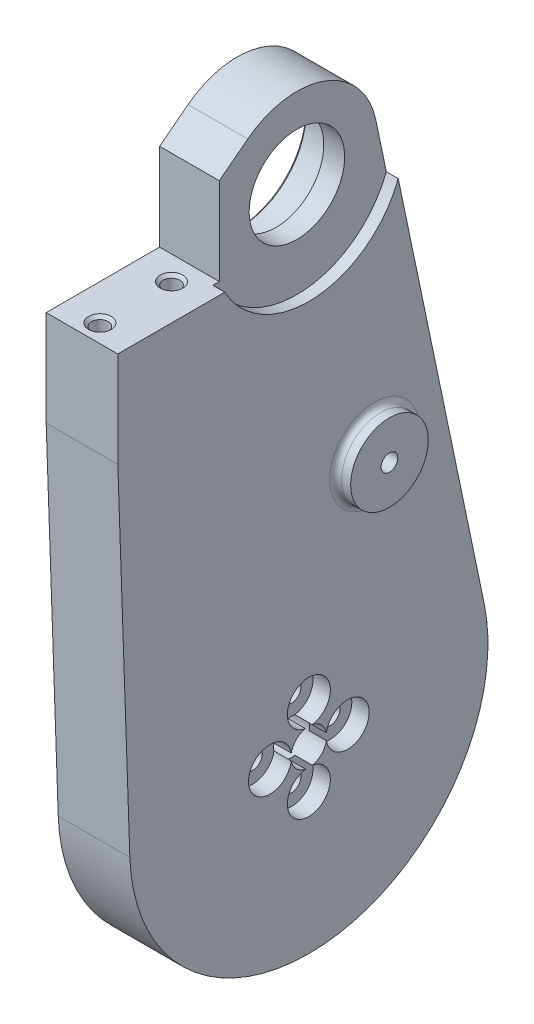
ISO-10303-21;
HEADER;
FILE_DESCRIPTION(('STEP AP214'),'2;1');
FILE_NAME('part.step','',(''),(''),'','','');
FILE_SCHEMA(('AUTOMOTIVE_DESIGN { 1 0 10303 214 1 1 1 1 }'));
ENDSEC;
DATA;
#1=APPLICATION_CONTEXT('core data for automotive mechanical design processes');
#2=APPLICATION_PROTOCOL_DEFINITION('international standard','automotive_design',2000,#1);
#3=PRODUCT_CONTEXT('',#1,'mechanical');
#4=PRODUCT('Part','Part','',(#3));
#5=PRODUCT_RELATED_PRODUCT_CATEGORY('part','',(#4));
#6=PRODUCT_DEFINITION_FORMATION('','',#4);
#7=PRODUCT_DEFINITION_CONTEXT('part definition',#1,'design');
#8=PRODUCT_DEFINITION('design','',#6,#7);
#9=PRODUCT_DEFINITION_SHAPE('','',#8);
#10=(LENGTH_UNIT() NAMED_UNIT(*) SI_UNIT(.MILLI.,.METRE.));
#11=(NAMED_UNIT(*) PLANE_ANGLE_UNIT() SI_UNIT($,.RADIAN.));
#12=(NAMED_UNIT(*) SI_UNIT($,.STERADIAN.) SOLID_ANGLE_UNIT());
#13=UNCERTAINTY_MEASURE_WITH_UNIT(LENGTH_MEASURE(1.E-05),#10,'distance_accuracy_value','');
#14=(GEOMETRIC_REPRESENTATION_CONTEXT(3) GLOBAL_UNCERTAINTY_ASSIGNED_CONTEXT((#13)) GLOBAL_UNIT_ASSIGNED_CONTEXT((#10,
#11,#12)) REPRESENTATION_CONTEXT('',''));
#15=CARTESIAN_POINT('',(0.,0.,0.));
#16=DIRECTION('',(0.,0.,1.));
#17=DIRECTION('',(1.,0.,0.));
#18=AXIS2_PLACEMENT_3D('',#15,#16,#17);
#19=CARTESIAN_POINT('',(57.,73.,32.));
#20=DIRECTION('',(0.,-0.7923556344167,-0.610059463173966));
#21=DIRECTION('',(0.,-0.610059463173966,0.792355634416701));
#22=AXIS2_PLACEMENT_3D('',#19,#20,#21);
#23=PLANE('',#22);
#24=DIRECTION('',(0.,0.610059463173966,-0.792355634416701));
#25=VECTOR('',#24,1.);
#26=CARTESIAN_POINT('',(55.,73.,32.));
#27=LINE('',#26,#25);
#28=CARTESIAN_POINT('',(55.,87.6286961268828,13.));
#29=VERTEX_POINT('',#28);
#30=CARTESIAN_POINT('',(55.,91.2968010646259,8.23580275284801));
#31=VERTEX_POINT('',#30);
#32=EDGE_CURVE('E202',#29,#31,#27,.T.);
#33=ORIENTED_EDGE('',*,*,#32,.T.);
#34=DIRECTION('',(-1.,0.,0.));
#35=VECTOR('',#34,1.);
#36=CARTESIAN_POINT('',(57.,91.2968010646259,8.235802752848));
#37=LINE('',#36,#35);
#38=CARTESIAN_POINT('',(45.,91.2968010646259,8.235802752848));
#39=VERTEX_POINT('',#38);
#40=EDGE_CURVE('E288',#31,#39,#37,.T.);
#41=ORIENTED_EDGE('',*,*,#40,.T.);
#42=DIRECTION('',(0.,0.610059463173966,-0.792355634416701));
#43=VECTOR('',#42,1.);
#44=CARTESIAN_POINT('',(45.,73.,32.));
#45=LINE('',#44,#43);
#46=CARTESIAN_POINT('',(45.,87.6286961268828,13.));
#47=VERTEX_POINT('',#46);
#48=EDGE_CURVE('E185',#47,#39,#45,.T.);
#49=ORIENTED_EDGE('',*,*,#48,.F.);
#50=DIRECTION('',(1.,0.,0.));
#51=VECTOR('',#50,1.);
#52=CARTESIAN_POINT('',(57.,87.6286961268828,13.));
#53=LINE('',#52,#51);
#54=EDGE_CURVE('E277',#47,#29,#53,.T.);
#55=ORIENTED_EDGE('',*,*,#54,.T.);
#56=EDGE_LOOP('',(#33,#41,#49,#55));
#57=FACE_BOUND('',#56,.T.);
#58=ADVANCED_FACE('F41',(#57),#23,.F.);
#59=CARTESIAN_POINT('',(57.,80.6,0.));
#60=DIRECTION('',(-1.,0.,0.));
#61=DIRECTION('',(0.,0.,-1.));
#62=AXIS2_PLACEMENT_3D('',#59,#60,#61);
#63=CYLINDRICAL_SURFACE('',#62,13.5);
#64=CARTESIAN_POINT('',(55.,80.6,0.));
#65=DIRECTION('',(-1.,0.,0.));
#66=DIRECTION('',(0.,0.,1.));
#67=AXIS2_PLACEMENT_3D('',#64,#65,#66);
#68=CIRCLE('',#67,13.5);
#69=CARTESIAN_POINT('',(55.,83.3636476426799,-13.2140929203298));
#70=VERTEX_POINT('',#69);
#71=EDGE_CURVE('E205',#31,#70,#68,.T.);
#72=ORIENTED_EDGE('',*,*,#71,.T.);
#73=DIRECTION('',(-1.,0.,0.));
#74=VECTOR('',#73,1.);
#75=CARTESIAN_POINT('',(57.,83.3636476426799,-13.2140929203298));
#76=LINE('',#75,#74);
#77=CARTESIAN_POINT('',(45.,83.3636476426799,-13.2140929203298));
#78=VERTEX_POINT('',#77);
#79=EDGE_CURVE('E315',#70,#78,#76,.T.);
#80=ORIENTED_EDGE('',*,*,#79,.T.);
#81=CARTESIAN_POINT('',(45.,80.6,0.));
#82=DIRECTION('',(-1.,0.,0.));
#83=DIRECTION('',(0.,0.,1.));
#84=AXIS2_PLACEMENT_3D('',#81,#82,#83);
#85=CIRCLE('',#84,13.5);
#86=EDGE_CURVE('E279',#39,#78,#85,.T.);
#87=ORIENTED_EDGE('',*,*,#86,.F.);
#88=ORIENTED_EDGE('',*,*,#40,.F.);
#89=EDGE_LOOP('',(#72,#80,#87,#88));
#90=FACE_BOUND('',#89,.T.);
#91=ADVANCED_FACE('F407',(#90),#63,.T.);
#92=CARTESIAN_POINT('',(85.,150.,13.));
#93=DIRECTION('',(0.,0.,1.));
#94=DIRECTION('',(-1.,0.,0.));
#95=AXIS2_PLACEMENT_3D('',#92,#93,#94);
#96=PLANE('',#95);
#97=ORIENTED_EDGE('',*,*,#54,.F.);
#98=DIRECTION('',(0.,1.,0.));
#99=VECTOR('',#98,1.);
#100=CARTESIAN_POINT('',(45.,80.6,13.));
#101=LINE('',#100,#99);
#102=CARTESIAN_POINT('',(45.,73.,13.));
#103=VERTEX_POINT('',#102);
#104=EDGE_CURVE('E318',#103,#47,#101,.T.);
#105=ORIENTED_EDGE('',*,*,#104,.F.);
#106=DIRECTION('',(-1.,0.,0.));
#107=VECTOR('',#106,1.);
#108=CARTESIAN_POINT('',(85.,73.,13.));
#109=LINE('',#108,#107);
#110=CARTESIAN_POINT('',(55.,73.,13.));
#111=VERTEX_POINT('',#110);
#112=EDGE_CURVE('E272',#111,#103,#109,.T.);
#113=ORIENTED_EDGE('',*,*,#112,.F.);
#114=DIRECTION('',(0.,-1.,0.));
#115=VECTOR('',#114,1.);
#116=CARTESIAN_POINT('',(55.,150.,13.));
#117=LINE('',#116,#115);
#118=EDGE_CURVE('E193',#29,#111,#117,.T.);
#119=ORIENTED_EDGE('',*,*,#118,.F.);
#120=EDGE_LOOP('',(#97,#105,#113,#119));
#121=FACE_BOUND('',#120,.T.);
#122=ADVANCED_FACE('F415',(#121),#96,.T.);
#123=CARTESIAN_POINT('',(37.,6.5,0.));
#124=DIRECTION('',(1.,0.,0.));
#125=DIRECTION('',(0.,0.,1.));
#126=AXIS2_PLACEMENT_3D('',#123,#124,#125);
#127=CYLINDRICAL_SURFACE('',#126,1.6);
#128=CARTESIAN_POINT('',(37.,6.5,0.));
#129=DIRECTION('',(-1.,0.,0.));
#130=DIRECTION('',(0.,-1.,0.));
#131=AXIS2_PLACEMENT_3D('',#128,#129,#130);
#132=CIRCLE('',#131,1.6);
#133=CARTESIAN_POINT('',(37.,4.9,0.));
#134=VERTEX_POINT('',#133);
#135=EDGE_CURVE('E234',#134,#134,#132,.T.);
#136=ORIENTED_EDGE('',*,*,#135,.T.);
#137=EDGE_LOOP('',(#136));
#138=FACE_BOUND('',#137,.T.);
#139=CARTESIAN_POINT('',(54.1,6.5,0.));
#140=DIRECTION('',(-1.,0.,0.));
#141=DIRECTION('',(0.,0.,1.));
#142=AXIS2_PLACEMENT_3D('',#139,#140,#141);
#143=CIRCLE('',#142,1.6);
#144=CARTESIAN_POINT('',(54.1,6.5,1.59999999999991));
#145=VERTEX_POINT('',#144);
#146=EDGE_CURVE('E230',#145,#145,#143,.F.);
#147=ORIENTED_EDGE('',*,*,#146,.T.);
#148=EDGE_LOOP('',(#147));
#149=FACE_BOUND('',#148,.T.);
#150=ADVANCED_FACE('F535',(#138,#149),#127,.F.);
#151=CARTESIAN_POINT('',(37.,0.,6.5));
#152=DIRECTION('',(1.,0.,0.));
#153=DIRECTION('',(0.,0.,1.));
#154=AXIS2_PLACEMENT_3D('',#151,#152,#153);
#155=CYLINDRICAL_SURFACE('',#154,1.6);
#156=CARTESIAN_POINT('',(37.,0.,6.5));
#157=DIRECTION('',(-1.,0.,0.));
#158=DIRECTION('',(0.,0.,-1.));
#159=AXIS2_PLACEMENT_3D('',#156,#157,#158);
#160=CIRCLE('',#159,1.6);
#161=CARTESIAN_POINT('',(37.,0.,4.9));
#162=VERTEX_POINT('',#161);
#163=EDGE_CURVE('E239',#162,#162,#160,.T.);
#164=ORIENTED_EDGE('',*,*,#163,.T.);
#165=EDGE_LOOP('',(#164));
#166=FACE_BOUND('',#165,.T.);
#167=CARTESIAN_POINT('',(54.1,0.,6.5));
#168=DIRECTION('',(-1.,0.,0.));
#169=DIRECTION('',(0.,0.,1.));
#170=AXIS2_PLACEMENT_3D('',#167,#168,#169);
#171=CIRCLE('',#170,1.6);
#172=CARTESIAN_POINT('',(54.1,0.,8.1));
#173=VERTEX_POINT('',#172);
#174=EDGE_CURVE('E226',#173,#173,#171,.F.);
#175=ORIENTED_EDGE('',*,*,#174,.T.);
#176=EDGE_LOOP('',(#175));
#177=FACE_BOUND('',#176,.T.);
#178=ADVANCED_FACE('F531',(#166,#177),#155,.F.);
#179=CARTESIAN_POINT('',(37.,-6.5,0.));
#180=DIRECTION('',(1.,0.,0.));
#181=DIRECTION('',(0.,0.,1.));
#182=AXIS2_PLACEMENT_3D('',#179,#180,#181);
#183=CYLINDRICAL_SURFACE('',#182,1.6);
#184=CARTESIAN_POINT('',(37.,-6.5,0.));
#185=DIRECTION('',(-1.,0.,0.));
#186=DIRECTION('',(0.,1.,0.));
#187=AXIS2_PLACEMENT_3D('',#184,#185,#186);
#188=CIRCLE('',#187,1.6);
#189=CARTESIAN_POINT('',(37.,-4.9,0.));
#190=VERTEX_POINT('',#189);
#191=EDGE_CURVE('E235',#190,#190,#188,.T.);
#192=ORIENTED_EDGE('',*,*,#191,.T.);
#193=EDGE_LOOP('',(#192));
#194=FACE_BOUND('',#193,.T.);
#195=CARTESIAN_POINT('',(54.1,-6.5,0.));
#196=DIRECTION('',(-1.,0.,0.));
#197=DIRECTION('',(0.,0.,1.));
#198=AXIS2_PLACEMENT_3D('',#195,#196,#197);
#199=CIRCLE('',#198,1.6);
#200=CARTESIAN_POINT('',(54.1,-6.5,1.60000000000005));
#201=VERTEX_POINT('',#200);
#202=EDGE_CURVE('E220',#201,#201,#199,.F.);
#203=ORIENTED_EDGE('',*,*,#202,.T.);
#204=EDGE_LOOP('',(#203));
#205=FACE_BOUND('',#204,.T.);
#206=ADVANCED_FACE('F527',(#194,#205),#183,.F.);
#207=CARTESIAN_POINT('',(37.,0.,-6.5));
#208=DIRECTION('',(1.,0.,0.));
#209=DIRECTION('',(0.,0.,1.));
#210=AXIS2_PLACEMENT_3D('',#207,#208,#209);
#211=CYLINDRICAL_SURFACE('',#210,1.6);
#212=CARTESIAN_POINT('',(37.,0.,-6.5));
#213=DIRECTION('',(-1.,0.,0.));
#214=DIRECTION('',(0.,0.,1.));
#215=AXIS2_PLACEMENT_3D('',#212,#213,#214);
#216=CIRCLE('',#215,1.6);
#217=CARTESIAN_POINT('',(37.,0.,-4.9));
#218=VERTEX_POINT('',#217);
#219=EDGE_CURVE('E252',#218,#218,#216,.T.);
#220=ORIENTED_EDGE('',*,*,#219,.T.);
#221=EDGE_LOOP('',(#220));
#222=FACE_BOUND('',#221,.T.);
#223=CARTESIAN_POINT('',(54.1,0.,-6.5));
#224=DIRECTION('',(-1.,0.,0.));
#225=DIRECTION('',(0.,0.,1.));
#226=AXIS2_PLACEMENT_3D('',#223,#224,#225);
#227=CIRCLE('',#226,1.6);
#228=CARTESIAN_POINT('',(54.1,0.,-4.9));
#229=VERTEX_POINT('',#228);
#230=EDGE_CURVE('E246',#229,#229,#227,.F.);
#231=ORIENTED_EDGE('',*,*,#230,.T.);
#232=EDGE_LOOP('',(#231));
#233=FACE_BOUND('',#232,.T.);
#234=ADVANCED_FACE('F530',(#222,#233),#211,.F.);
#235=CARTESIAN_POINT('',(57.,80.6,0.));
#236=DIRECTION('',(1.,0.,0.));
#237=DIRECTION('',(0.,0.,1.));
#238=AXIS2_PLACEMENT_3D('',#235,#236,#237);
#239=PLANE('',#238);
#240=CARTESIAN_POINT('',(57.,37.,-11.));
#241=DIRECTION('',(-1.,0.,0.));
#242=DIRECTION('',(0.,0.,1.));
#243=AXIS2_PLACEMENT_3D('',#240,#241,#242);
#244=CIRCLE('',#243,7.5);
#245=CARTESIAN_POINT('',(57.,37.,-3.5));
#246=VERTEX_POINT('',#245);
#247=EDGE_CURVE('E371',#246,#246,#244,.F.);
#248=ORIENTED_EDGE('',*,*,#247,.F.);
#249=EDGE_LOOP('',(#248));
#250=FACE_BOUND('',#249,.T.);
#251=CARTESIAN_POINT('',(57.,80.6,0.));
#252=DIRECTION('',(-1.,0.,0.));
#253=DIRECTION('',(0.,0.,1.));
#254=AXIS2_PLACEMENT_3D('',#251,#252,#253);
#255=CIRCLE('',#254,16.);
#256=CARTESIAN_POINT('',(57.,74.957740266821,-14.9721376263828));
#257=VERTEX_POINT('',#256);
#258=CARTESIAN_POINT('',(57.,73.,14.0797727254384));
#259=VERTEX_POINT('',#258);
#260=EDGE_CURVE('E181',#257,#259,#255,.T.);
#261=ORIENTED_EDGE('',*,*,#260,.T.);
#262=DIRECTION('',(0.,0.,-1.));
#263=VECTOR('',#262,1.);
#264=CARTESIAN_POINT('',(57.,73.,0.));
#265=LINE('',#264,#263);
#266=CARTESIAN_POINT('',(57.,73.,32.));
#267=VERTEX_POINT('',#266);
#268=EDGE_CURVE('E275',#267,#259,#265,.T.);
#269=ORIENTED_EDGE('',*,*,#268,.F.);
#270=DIRECTION('',(0.,1.,0.));
#271=VECTOR('',#270,1.);
#272=CARTESIAN_POINT('',(57.,57.,32.));
#273=LINE('',#272,#271);
#274=CARTESIAN_POINT('',(57.,57.,32.));
#275=VERTEX_POINT('',#274);
#276=EDGE_CURVE('E285',#275,#267,#273,.T.);
#277=ORIENTED_EDGE('',*,*,#276,.F.);
#278=DIRECTION('',(0.,0.999396082337188,0.0347486778033337));
#279=VECTOR('',#278,1.);
#280=CARTESIAN_POINT('',(57.,-1.04246033410001,29.9818824701157));
#281=LINE('',#280,#279);
#282=CARTESIAN_POINT('',(57.,-1.04246033410001,29.9818824701157));
#283=VERTEX_POINT('',#282);
#284=EDGE_CURVE('E282',#283,#275,#281,.T.);
#285=ORIENTED_EDGE('',*,*,#284,.F.);
#286=CARTESIAN_POINT('',(57.,0.,0.));
#287=DIRECTION('',(-1.,0.,0.));
#288=DIRECTION('',(0.,0.,1.));
#289=AXIS2_PLACEMENT_3D('',#286,#287,#288);
#290=CIRCLE('',#289,30.);
#291=CARTESIAN_POINT('',(57.,6.14143920595533,-29.3646509340662));
#292=VERTEX_POINT('',#291);
#293=EDGE_CURVE('E184',#292,#283,#290,.T.);
#294=ORIENTED_EDGE('',*,*,#293,.F.);
#295=DIRECTION('',(0.,-0.978821697802207,-0.204714640198511));
#296=VECTOR('',#295,1.);
#297=CARTESIAN_POINT('',(57.,83.3636476426799,-13.2140929203298));
#298=LINE('',#297,#296);
#299=EDGE_CURVE('E169',#257,#292,#298,.T.);
#300=ORIENTED_EDGE('',*,*,#299,.F.);
#301=EDGE_LOOP('',(#261,#269,#277,#285,#294,#300));
#302=FACE_BOUND('',#301,.T.);
#303=CARTESIAN_POINT('',(57.,0.,6.5));
#304=DIRECTION('',(-1.,0.,0.));
#305=DIRECTION('',(0.,0.,-1.));
#306=AXIS2_PLACEMENT_3D('',#303,#304,#305);
#307=CIRCLE('',#306,3.6);
#308=CARTESIAN_POINT('',(57.,-0.569832841678687,2.94538461538462));
#309=VERTEX_POINT('',#308);
#310=CARTESIAN_POINT('',(57.,0.569832841678709,2.94538461538461));
#311=VERTEX_POINT('',#310);
#312=EDGE_CURVE('E211',#309,#311,#307,.T.);
#313=ORIENTED_EDGE('',*,*,#312,.T.);
#314=CARTESIAN_POINT('',(57.,0.,0.));
#315=DIRECTION('',(-1.,0.,0.));
#316=DIRECTION('',(0.,0.,1.));
#317=AXIS2_PLACEMENT_3D('',#314,#315,#316);
#318=CIRCLE('',#317,3.);
#319=CARTESIAN_POINT('',(57.,2.94538461538462,0.569832841678656));
#320=VERTEX_POINT('',#319);
#321=EDGE_CURVE('E984',#311,#320,#318,.T.);
#322=ORIENTED_EDGE('',*,*,#321,.T.);
#323=CARTESIAN_POINT('',(57.,6.5,0.));
#324=DIRECTION('',(-1.,0.,0.));
#325=DIRECTION('',(0.,-1.,0.));
#326=AXIS2_PLACEMENT_3D('',#323,#324,#325);
#327=CIRCLE('',#326,3.6);
#328=CARTESIAN_POINT('',(57.,2.94538461538461,-0.56983284167874));
#329=VERTEX_POINT('',#328);
#330=EDGE_CURVE('E174',#320,#329,#327,.T.);
#331=ORIENTED_EDGE('',*,*,#330,.T.);
#332=CARTESIAN_POINT('',(57.,0.569832841678687,-2.94538461538462));
#333=VERTEX_POINT('',#332);
#334=EDGE_CURVE('E255',#329,#333,#318,.T.);
#335=ORIENTED_EDGE('',*,*,#334,.T.);
#336=CARTESIAN_POINT('',(57.,0.,-6.5));
#337=DIRECTION('',(-1.,0.,0.));
#338=DIRECTION('',(0.,0.,1.));
#339=AXIS2_PLACEMENT_3D('',#336,#337,#338);
#340=CIRCLE('',#339,3.6);
#341=CARTESIAN_POINT('',(57.,-0.569832841678709,-2.94538461538461));
#342=VERTEX_POINT('',#341);
#343=EDGE_CURVE('E238',#333,#342,#340,.T.);
#344=ORIENTED_EDGE('',*,*,#343,.T.);
#345=CARTESIAN_POINT('',(57.,-2.94538461538462,-0.569832841678677));
#346=VERTEX_POINT('',#345);
#347=EDGE_CURVE('E260',#342,#346,#318,.T.);
#348=ORIENTED_EDGE('',*,*,#347,.T.);
#349=CARTESIAN_POINT('',(57.,-6.5,0.));
#350=DIRECTION('',(-1.,0.,0.));
#351=DIRECTION('',(0.,1.,0.));
#352=AXIS2_PLACEMENT_3D('',#349,#350,#351);
#353=CIRCLE('',#352,3.6);
#354=CARTESIAN_POINT('',(57.,-2.94538461538461,0.569832841678719));
#355=VERTEX_POINT('',#354);
#356=EDGE_CURVE('E215',#346,#355,#353,.T.);
#357=ORIENTED_EDGE('',*,*,#356,.T.);
#358=EDGE_CURVE('E263',#355,#309,#318,.T.);
#359=ORIENTED_EDGE('',*,*,#358,.T.);
#360=EDGE_LOOP('',(#313,#322,#331,#335,#344,#348,#357,#359));
#361=FACE_BOUND('',#360,.T.);
#362=ADVANCED_FACE('F178',(#250,#302,#361),#239,.T.);
#363=CARTESIAN_POINT('',(45.,80.6,0.));
#364=DIRECTION('',(1.,0.,0.));
#365=DIRECTION('',(0.,0.,1.));
#366=AXIS2_PLACEMENT_3D('',#363,#364,#365);
#367=PLANE('',#366);
#368=CARTESIAN_POINT('',(45.,80.6,0.));
#369=DIRECTION('',(-1.,0.,0.));
#370=DIRECTION('',(0.,0.,1.));
#371=AXIS2_PLACEMENT_3D('',#368,#369,#370);
#372=CIRCLE('',#371,11.5);
#373=CARTESIAN_POINT('',(45.,80.6,11.5));
#374=VERTEX_POINT('',#373);
#375=EDGE_CURVE('E365',#374,#374,#372,.T.);
#376=ORIENTED_EDGE('',*,*,#375,.F.);
#377=EDGE_LOOP('',(#376));
#378=FACE_BOUND('',#377,.T.);
#379=CARTESIAN_POINT('',(45.,0.,0.));
#380=DIRECTION('',(-1.,0.,0.));
#381=DIRECTION('',(0.,0.,1.));
#382=AXIS2_PLACEMENT_3D('',#379,#380,#381);
#383=CIRCLE('',#382,11.5);
#384=CARTESIAN_POINT('',(45.,0.,11.5));
#385=VERTEX_POINT('',#384);
#386=EDGE_CURVE('E320',#385,#385,#383,.F.);
#387=ORIENTED_EDGE('',*,*,#386,.T.);
#388=EDGE_LOOP('',(#387));
#389=FACE_BOUND('',#388,.T.);
#390=ORIENTED_EDGE('',*,*,#104,.T.);
#391=ORIENTED_EDGE('',*,*,#48,.T.);
#392=ORIENTED_EDGE('',*,*,#86,.T.);
#393=DIRECTION('',(0.,-0.978821697802207,-0.204714640198511));
#394=VECTOR('',#393,1.);
#395=CARTESIAN_POINT('',(45.,83.3636476426799,-13.2140929203298));
#396=LINE('',#395,#394);
#397=CARTESIAN_POINT('',(45.,6.14143920595533,-29.3646509340662));
#398=VERTEX_POINT('',#397);
#399=EDGE_CURVE('E291',#78,#398,#396,.T.);
#400=ORIENTED_EDGE('',*,*,#399,.T.);
#401=CARTESIAN_POINT('',(45.,0.,0.));
#402=DIRECTION('',(-1.,0.,0.));
#403=DIRECTION('',(0.,0.,1.));
#404=AXIS2_PLACEMENT_3D('',#401,#402,#403);
#405=CIRCLE('',#404,30.);
#406=CARTESIAN_POINT('',(45.,-1.04246033410001,29.9818824701157));
#407=VERTEX_POINT('',#406);
#408=EDGE_CURVE('E294',#398,#407,#405,.T.);
#409=ORIENTED_EDGE('',*,*,#408,.T.);
#410=DIRECTION('',(0.,0.999396082337188,0.0347486778033337));
#411=VECTOR('',#410,1.);
#412=CARTESIAN_POINT('',(45.,-1.04246033410001,29.9818824701157));
#413=LINE('',#412,#411);
#414=CARTESIAN_POINT('',(45.,57.,32.));
#415=VERTEX_POINT('',#414);
#416=EDGE_CURVE('E297',#407,#415,#413,.T.);
#417=ORIENTED_EDGE('',*,*,#416,.T.);
#418=DIRECTION('',(0.,1.,0.));
#419=VECTOR('',#418,1.);
#420=CARTESIAN_POINT('',(45.,57.,32.));
#421=LINE('',#420,#419);
#422=CARTESIAN_POINT('',(45.,73.,32.));
#423=VERTEX_POINT('',#422);
#424=EDGE_CURVE('E300',#415,#423,#421,.T.);
#425=ORIENTED_EDGE('',*,*,#424,.T.);
#426=DIRECTION('',(0.,0.,1.));
#427=VECTOR('',#426,1.);
#428=CARTESIAN_POINT('',(45.,73.,13.));
#429=LINE('',#428,#427);
#430=EDGE_CURVE('E269',#103,#423,#429,.T.);
#431=ORIENTED_EDGE('',*,*,#430,.F.);
#432=EDGE_LOOP('',(#390,#391,#392,#400,#409,#417,#425,#431));
#433=FACE_BOUND('',#432,.T.);
#434=ADVANCED_FACE('F403',(#378,#389,#433),#367,.F.);
#435=CARTESIAN_POINT('',(57.,83.3636476426799,-13.2140929203298));
#436=DIRECTION('',(0.,-0.204714640198511,0.978821697802206));
#437=DIRECTION('',(0.,0.978821697802207,0.204714640198511));
#438=AXIS2_PLACEMENT_3D('',#435,#436,#437);
#439=PLANE('',#438);
#440=ORIENTED_EDGE('',*,*,#299,.T.);
#441=DIRECTION('',(-1.,0.,0.));
#442=VECTOR('',#441,1.);
#443=CARTESIAN_POINT('',(57.,6.14143920595533,-29.3646509340662));
#444=LINE('',#443,#442);
#445=EDGE_CURVE('E313',#292,#398,#444,.T.);
#446=ORIENTED_EDGE('',*,*,#445,.T.);
#447=ORIENTED_EDGE('',*,*,#399,.F.);
#448=ORIENTED_EDGE('',*,*,#79,.F.);
#449=DIRECTION('',(0.,-0.978821697802207,-0.204714640198511));
#450=VECTOR('',#449,1.);
#451=CARTESIAN_POINT('',(55.,83.3636476426799,-13.2140929203298));
#452=LINE('',#451,#450);
#453=CARTESIAN_POINT('',(55.,74.957740266821,-14.9721376263828));
#454=VERTEX_POINT('',#453);
#455=EDGE_CURVE('E172',#70,#454,#452,.T.);
#456=ORIENTED_EDGE('',*,*,#455,.T.);
#457=DIRECTION('',(1.,0.,0.));
#458=VECTOR('',#457,1.);
#459=CARTESIAN_POINT('',(55.,74.957740266821,-14.9721376263828));
#460=LINE('',#459,#458);
#461=EDGE_CURVE('E166',#257,#454,#460,.F.);
#462=ORIENTED_EDGE('',*,*,#461,.F.);
#463=EDGE_LOOP('',(#440,#446,#447,#448,#456,#462));
#464=FACE_BOUND('',#463,.T.);
#465=ADVANCED_FACE('F168',(#464),#439,.F.);
#466=CARTESIAN_POINT('',(57.,0.,0.));
#467=DIRECTION('',(-1.,0.,0.));
#468=DIRECTION('',(0.,0.,-1.));
#469=AXIS2_PLACEMENT_3D('',#466,#467,#468);
#470=CYLINDRICAL_SURFACE('',#469,30.);
#471=ORIENTED_EDGE('',*,*,#408,.F.);
#472=ORIENTED_EDGE('',*,*,#445,.F.);
#473=ORIENTED_EDGE('',*,*,#293,.T.);
#474=DIRECTION('',(-1.,0.,0.));
#475=VECTOR('',#474,1.);
#476=CARTESIAN_POINT('',(57.,-1.04246033410001,29.9818824701157));
#477=LINE('',#476,#475);
#478=EDGE_CURVE('E311',#283,#407,#477,.T.);
#479=ORIENTED_EDGE('',*,*,#478,.T.);
#480=EDGE_LOOP('',(#471,#472,#473,#479));
#481=FACE_BOUND('',#480,.T.);
#482=ADVANCED_FACE('F401',(#481),#470,.T.);
#483=CARTESIAN_POINT('',(57.,-1.04246033410001,29.9818824701157));
#484=DIRECTION('',(0.,0.0347486778033337,-0.999396082337188));
#485=DIRECTION('',(0.,-0.999396082337188,-0.0347486778033337));
#486=AXIS2_PLACEMENT_3D('',#483,#484,#485);
#487=PLANE('',#486);
#488=ORIENTED_EDGE('',*,*,#416,.F.);
#489=ORIENTED_EDGE('',*,*,#478,.F.);
#490=ORIENTED_EDGE('',*,*,#284,.T.);
#491=DIRECTION('',(-1.,0.,0.));
#492=VECTOR('',#491,1.);
#493=CARTESIAN_POINT('',(57.,57.,32.));
#494=LINE('',#493,#492);
#495=EDGE_CURVE('E309',#275,#415,#494,.T.);
#496=ORIENTED_EDGE('',*,*,#495,.T.);
#497=EDGE_LOOP('',(#488,#489,#490,#496));
#498=FACE_BOUND('',#497,.T.);
#499=ADVANCED_FACE('F398',(#498),#487,.F.);
#500=CARTESIAN_POINT('',(57.,57.,32.));
#501=DIRECTION('',(0.,0.,-1.));
#502=DIRECTION('',(1.,0.,0.));
#503=AXIS2_PLACEMENT_3D('',#500,#501,#502);
#504=PLANE('',#503);
#505=ORIENTED_EDGE('',*,*,#424,.F.);
#506=ORIENTED_EDGE('',*,*,#495,.F.);
#507=ORIENTED_EDGE('',*,*,#276,.T.);
#508=DIRECTION('',(-1.,0.,0.));
#509=VECTOR('',#508,1.);
#510=CARTESIAN_POINT('',(57.,73.,32.));
#511=LINE('',#510,#509);
#512=EDGE_CURVE('E307',#267,#423,#511,.T.);
#513=ORIENTED_EDGE('',*,*,#512,.T.);
#514=EDGE_LOOP('',(#505,#506,#507,#513));
#515=FACE_BOUND('',#514,.T.);
#516=ADVANCED_FACE('F389',(#515),#504,.F.);
#517=CARTESIAN_POINT('',(85.,73.,13.));
#518=DIRECTION('',(0.,1.,0.));
#519=DIRECTION('',(0.,0.,-1.));
#520=AXIS2_PLACEMENT_3D('',#517,#518,#519);
#521=PLANE('',#520);
#522=CARTESIAN_POINT('',(51.,73.,29.));
#523=DIRECTION('',(0.,-1.,0.));
#524=DIRECTION('',(0.,0.,-1.));
#525=AXIS2_PLACEMENT_3D('',#522,#523,#524);
#526=CIRCLE('',#525,1.9);
#527=CARTESIAN_POINT('',(51.,73.,27.1));
#528=VERTEX_POINT('',#527);
#529=EDGE_CURVE('E49',#528,#528,#526,.F.);
#530=ORIENTED_EDGE('',*,*,#529,.F.);
#531=EDGE_LOOP('',(#530));
#532=FACE_BOUND('',#531,.T.);
#533=CARTESIAN_POINT('',(51.,73.,17.));
#534=DIRECTION('',(0.,-1.,0.));
#535=DIRECTION('',(0.,0.,-1.));
#536=AXIS2_PLACEMENT_3D('',#533,#534,#535);
#537=CIRCLE('',#536,1.9);
#538=CARTESIAN_POINT('',(51.,73.,15.1));
#539=VERTEX_POINT('',#538);
#540=EDGE_CURVE('E377',#539,#539,#537,.F.);
#541=ORIENTED_EDGE('',*,*,#540,.F.);
#542=EDGE_LOOP('',(#541));
#543=FACE_BOUND('',#542,.T.);
#544=DIRECTION('',(1.,0.,0.));
#545=VECTOR('',#544,1.);
#546=CARTESIAN_POINT('',(55.,73.,14.0797727254384));
#547=LINE('',#546,#545);
#548=CARTESIAN_POINT('',(55.,73.,14.0797727254384));
#549=VERTEX_POINT('',#548);
#550=EDGE_CURVE('E189',#259,#549,#547,.F.);
#551=ORIENTED_EDGE('',*,*,#550,.T.);
#552=DIRECTION('',(0.,0.,1.));
#553=VECTOR('',#552,1.);
#554=CARTESIAN_POINT('',(55.,73.,13.));
#555=LINE('',#554,#553);
#556=EDGE_CURVE('E350',#111,#549,#555,.T.);
#557=ORIENTED_EDGE('',*,*,#556,.F.);
#558=ORIENTED_EDGE('',*,*,#112,.T.);
#559=ORIENTED_EDGE('',*,*,#430,.T.);
#560=ORIENTED_EDGE('',*,*,#512,.F.);
#561=ORIENTED_EDGE('',*,*,#268,.T.);
#562=EDGE_LOOP('',(#551,#557,#558,#559,#560,#561));
#563=FACE_BOUND('',#562,.T.);
#564=ADVANCED_FACE('F385',(#532,#543,#563),#521,.T.);
#565=CARTESIAN_POINT('',(37.,0.,0.));
#566=DIRECTION('',(1.,0.,0.));
#567=DIRECTION('',(0.,0.,1.));
#568=AXIS2_PLACEMENT_3D('',#565,#566,#567);
#569=PLANE('',#568);
#570=CARTESIAN_POINT('',(37.,0.,0.));
#571=DIRECTION('',(-1.,0.,0.));
#572=DIRECTION('',(0.,0.,1.));
#573=AXIS2_PLACEMENT_3D('',#570,#571,#572);
#574=CIRCLE('',#573,9.50000000000001);
#575=CARTESIAN_POINT('',(37.,0.,9.50000000000001));
#576=VERTEX_POINT('',#575);
#577=EDGE_CURVE('E353',#576,#576,#574,.F.);
#578=ORIENTED_EDGE('',*,*,#577,.F.);
#579=EDGE_LOOP('',(#578));
#580=FACE_BOUND('',#579,.T.);
#581=ORIENTED_EDGE('',*,*,#191,.F.);
#582=EDGE_LOOP('',(#581));
#583=FACE_BOUND('',#582,.T.);
#584=ORIENTED_EDGE('',*,*,#163,.F.);
#585=EDGE_LOOP('',(#584));
#586=FACE_BOUND('',#585,.T.);
#587=ORIENTED_EDGE('',*,*,#135,.F.);
#588=EDGE_LOOP('',(#587));
#589=FACE_BOUND('',#588,.T.);
#590=ORIENTED_EDGE('',*,*,#219,.F.);
#591=EDGE_LOOP('',(#590));
#592=FACE_BOUND('',#591,.T.);
#593=CARTESIAN_POINT('',(37.,0.,0.));
#594=DIRECTION('',(-1.,0.,0.));
#595=DIRECTION('',(0.,0.,1.));
#596=AXIS2_PLACEMENT_3D('',#593,#594,#595);
#597=CIRCLE('',#596,3.);
#598=CARTESIAN_POINT('',(37.,0.,3.));
#599=VERTEX_POINT('',#598);
#600=EDGE_CURVE('E256',#599,#599,#597,.T.);
#601=ORIENTED_EDGE('',*,*,#600,.F.);
#602=EDGE_LOOP('',(#601));
#603=FACE_BOUND('',#602,.T.);
#604=ADVANCED_FACE('F388',(#580,#583,#586,#589,#592,#603),#569,.F.);
#605=CARTESIAN_POINT('',(-10.123,0.,0.));
#606=DIRECTION('',(-1.,0.,0.));
#607=DIRECTION('',(0.,0.,-1.));
#608=AXIS2_PLACEMENT_3D('',#605,#606,#607);
#609=CYLINDRICAL_SURFACE('',#608,10.);
#610=CARTESIAN_POINT('',(37.5,0.,0.));
#611=DIRECTION('',(-1.,0.,0.));
#612=DIRECTION('',(0.,0.,1.));
#613=AXIS2_PLACEMENT_3D('',#610,#611,#612);
#614=CIRCLE('',#613,10.);
#615=CARTESIAN_POINT('',(37.5,0.,10.));
#616=VERTEX_POINT('',#615);
#617=EDGE_CURVE('E356',#616,#616,#614,.T.);
#618=ORIENTED_EDGE('',*,*,#617,.F.);
#619=EDGE_LOOP('',(#618));
#620=FACE_BOUND('',#619,.T.);
#621=CARTESIAN_POINT('',(44.,0.,0.));
#622=DIRECTION('',(1.,0.,0.));
#623=DIRECTION('',(0.,0.,-1.));
#624=AXIS2_PLACEMENT_3D('',#621,#622,#623);
#625=CIRCLE('',#624,10.);
#626=CARTESIAN_POINT('',(44.,0.,-10.));
#627=VERTEX_POINT('',#626);
#628=EDGE_CURVE('E266',#627,#627,#625,.T.);
#629=ORIENTED_EDGE('',*,*,#628,.F.);
#630=EDGE_LOOP('',(#629));
#631=FACE_BOUND('',#630,.T.);
#632=ADVANCED_FACE('F561',(#620,#631),#609,.T.);
#633=CARTESIAN_POINT('',(44.,10.,0.));
#634=DIRECTION('',(1.,0.,0.));
#635=DIRECTION('',(0.,0.,1.));
#636=AXIS2_PLACEMENT_3D('',#633,#634,#635);
#637=PLANE('',#636);
#638=ORIENTED_EDGE('',*,*,#628,.T.);
#639=EDGE_LOOP('',(#638));
#640=FACE_BOUND('',#639,.T.);
#641=CARTESIAN_POINT('',(44.,0.,0.));
#642=DIRECTION('',(1.,0.,0.));
#643=DIRECTION('',(0.,0.,-1.));
#644=AXIS2_PLACEMENT_3D('',#641,#642,#643);
#645=CIRCLE('',#644,11.5);
#646=CARTESIAN_POINT('',(44.,0.,-11.5));
#647=VERTEX_POINT('',#646);
#648=EDGE_CURVE('E259',#647,#647,#645,.T.);
#649=ORIENTED_EDGE('',*,*,#648,.F.);
#650=EDGE_LOOP('',(#649));
#651=FACE_BOUND('',#650,.T.);
#652=ADVANCED_FACE('F557',(#640,#651),#637,.F.);
#653=CARTESIAN_POINT('',(-10.123,0.,0.));
#654=DIRECTION('',(-1.,0.,0.));
#655=DIRECTION('',(0.,0.,-1.));
#656=AXIS2_PLACEMENT_3D('',#653,#654,#655);
#657=CYLINDRICAL_SURFACE('',#656,11.5);
#658=ORIENTED_EDGE('',*,*,#648,.T.);
#659=EDGE_LOOP('',(#658));
#660=FACE_BOUND('',#659,.T.);
#661=ORIENTED_EDGE('',*,*,#386,.F.);
#662=EDGE_LOOP('',(#661));
#663=FACE_BOUND('',#662,.T.);
#664=ADVANCED_FACE('F553',(#660,#663),#657,.T.);
#665=CARTESIAN_POINT('',(37.,0.,0.));
#666=DIRECTION('',(1.,0.,0.));
#667=DIRECTION('',(0.,0.,1.));
#668=AXIS2_PLACEMENT_3D('',#665,#666,#667);
#669=CYLINDRICAL_SURFACE('',#668,3.);
#670=ORIENTED_EDGE('',*,*,#600,.T.);
#671=EDGE_LOOP('',(#670));
#672=FACE_BOUND('',#671,.T.);
#673=CARTESIAN_POINT('',(54.1,0.,0.));
#674=DIRECTION('',(-1.,0.,0.));
#675=DIRECTION('',(0.,0.,1.));
#676=AXIS2_PLACEMENT_3D('',#673,#674,#675);
#677=CIRCLE('',#676,3.);
#678=CARTESIAN_POINT('',(54.1,0.569832841678709,2.94538461538461));
#679=VERTEX_POINT('',#678);
#680=CARTESIAN_POINT('',(54.1,-0.569832841678687,2.94538461538462));
#681=VERTEX_POINT('',#680);
#682=EDGE_CURVE('E227',#679,#681,#677,.F.);
#683=ORIENTED_EDGE('',*,*,#682,.T.);
#684=DIRECTION('',(1.,0.,0.));
#685=VECTOR('',#684,1.);
#686=CARTESIAN_POINT('',(55.55,-0.569832841678688,2.94538461538462));
#687=LINE('',#686,#685);
#688=EDGE_CURVE('E346',#309,#681,#687,.F.);
#689=ORIENTED_EDGE('',*,*,#688,.F.);
#690=ORIENTED_EDGE('',*,*,#358,.F.);
#691=DIRECTION('',(1.,0.,0.));
#692=VECTOR('',#691,1.);
#693=CARTESIAN_POINT('',(55.55,-2.94538461538461,0.569832841678721));
#694=LINE('',#693,#692);
#695=CARTESIAN_POINT('',(54.1,-2.94538461538461,0.569832841678719));
#696=VERTEX_POINT('',#695);
#697=EDGE_CURVE('E339',#696,#355,#694,.T.);
#698=ORIENTED_EDGE('',*,*,#697,.F.);
#699=CARTESIAN_POINT('',(54.1,0.,0.));
#700=DIRECTION('',(-1.,0.,0.));
#701=DIRECTION('',(0.,0.,1.));
#702=AXIS2_PLACEMENT_3D('',#699,#700,#701);
#703=CIRCLE('',#702,3.);
#704=CARTESIAN_POINT('',(54.1,-2.94538461538462,-0.569832841678677));
#705=VERTEX_POINT('',#704);
#706=EDGE_CURVE('E223',#696,#705,#703,.F.);
#707=ORIENTED_EDGE('',*,*,#706,.T.);
#708=DIRECTION('',(1.,0.,0.));
#709=VECTOR('',#708,1.);
#710=CARTESIAN_POINT('',(55.55,-2.94538461538462,-0.569832841678678));
#711=LINE('',#710,#709);
#712=EDGE_CURVE('E330',#346,#705,#711,.F.);
#713=ORIENTED_EDGE('',*,*,#712,.F.);
#714=ORIENTED_EDGE('',*,*,#347,.F.);
#715=DIRECTION('',(1.,0.,0.));
#716=VECTOR('',#715,1.);
#717=CARTESIAN_POINT('',(55.55,-0.569832841678711,-2.94538461538461));
#718=LINE('',#717,#716);
#719=CARTESIAN_POINT('',(54.1,-0.569832841678709,-2.94538461538461));
#720=VERTEX_POINT('',#719);
#721=EDGE_CURVE('E328',#720,#342,#718,.T.);
#722=ORIENTED_EDGE('',*,*,#721,.F.);
#723=CARTESIAN_POINT('',(54.1,0.,0.));
#724=DIRECTION('',(-1.,0.,0.));
#725=DIRECTION('',(0.,0.,1.));
#726=AXIS2_PLACEMENT_3D('',#723,#724,#725);
#727=CIRCLE('',#726,3.);
#728=CARTESIAN_POINT('',(54.1,0.569832841678687,-2.94538461538462));
#729=VERTEX_POINT('',#728);
#730=EDGE_CURVE('E249',#720,#729,#727,.F.);
#731=ORIENTED_EDGE('',*,*,#730,.T.);
#732=DIRECTION('',(1.,0.,0.));
#733=VECTOR('',#732,1.);
#734=CARTESIAN_POINT('',(55.55,0.569832841678688,-2.94538461538462));
#735=LINE('',#734,#733);
#736=EDGE_CURVE('E323',#333,#729,#735,.F.);
#737=ORIENTED_EDGE('',*,*,#736,.F.);
#738=ORIENTED_EDGE('',*,*,#334,.F.);
#739=DIRECTION('',(1.,0.,0.));
#740=VECTOR('',#739,1.);
#741=CARTESIAN_POINT('',(55.55,2.94538461538461,-0.569832841678741));
#742=LINE('',#741,#740);
#743=CARTESIAN_POINT('',(54.1,2.94538461538461,-0.56983284167874));
#744=VERTEX_POINT('',#743);
#745=EDGE_CURVE('E344',#744,#329,#742,.T.);
#746=ORIENTED_EDGE('',*,*,#745,.F.);
#747=CARTESIAN_POINT('',(54.1,0.,0.));
#748=DIRECTION('',(-1.,0.,0.));
#749=DIRECTION('',(0.,0.,1.));
#750=AXIS2_PLACEMENT_3D('',#747,#748,#749);
#751=CIRCLE('',#750,3.);
#752=CARTESIAN_POINT('',(54.1,2.94538461538462,0.569832841678656));
#753=VERTEX_POINT('',#752);
#754=EDGE_CURVE('E231',#744,#753,#751,.F.);
#755=ORIENTED_EDGE('',*,*,#754,.T.);
#756=DIRECTION('',(1.,0.,0.));
#757=VECTOR('',#756,1.);
#758=CARTESIAN_POINT('',(55.55,2.94538461538462,0.569832841678657));
#759=LINE('',#758,#757);
#760=EDGE_CURVE('E341',#320,#753,#759,.F.);
#761=ORIENTED_EDGE('',*,*,#760,.F.);
#762=ORIENTED_EDGE('',*,*,#321,.F.);
#763=DIRECTION('',(1.,0.,0.));
#764=VECTOR('',#763,1.);
#765=CARTESIAN_POINT('',(55.55,0.569832841678711,2.94538461538461));
#766=LINE('',#765,#764);
#767=EDGE_CURVE('E348',#679,#311,#766,.T.);
#768=ORIENTED_EDGE('',*,*,#767,.F.);
#769=EDGE_LOOP('',(#683,#689,#690,#698,#707,#713,#714,#722,#731,#737,#738,#746,#755,#761,#762,#768));
#770=FACE_BOUND('',#769,.T.);
#771=ADVANCED_FACE('F546',(#672,#770),#669,.F.);
#772=CARTESIAN_POINT('',(54.1,0.,-6.5));
#773=DIRECTION('',(1.,0.,0.));
#774=DIRECTION('',(0.,0.,1.));
#775=AXIS2_PLACEMENT_3D('',#772,#773,#774);
#776=CYLINDRICAL_SURFACE('',#775,3.6);
#777=CARTESIAN_POINT('',(54.1,0.,-6.5));
#778=DIRECTION('',(-1.,0.,0.));
#779=DIRECTION('',(0.,0.,1.));
#780=AXIS2_PLACEMENT_3D('',#777,#778,#779);
#781=CIRCLE('',#780,3.6);
#782=EDGE_CURVE('E244',#729,#720,#781,.T.);
#783=ORIENTED_EDGE('',*,*,#782,.T.);
#784=ORIENTED_EDGE('',*,*,#721,.T.);
#785=ORIENTED_EDGE('',*,*,#343,.F.);
#786=ORIENTED_EDGE('',*,*,#736,.T.);
#787=EDGE_LOOP('',(#783,#784,#785,#786));
#788=FACE_BOUND('',#787,.T.);
#789=ADVANCED_FACE('F542',(#788),#776,.F.);
#790=CARTESIAN_POINT('',(54.1,0.,-6.5));
#791=DIRECTION('',(1.,0.,0.));
#792=DIRECTION('',(0.,0.,1.));
#793=AXIS2_PLACEMENT_3D('',#790,#791,#792);
#794=PLANE('',#793);
#795=ORIENTED_EDGE('',*,*,#230,.F.);
#796=EDGE_LOOP('',(#795));
#797=FACE_BOUND('',#796,.T.);
#798=ORIENTED_EDGE('',*,*,#730,.F.);
#799=ORIENTED_EDGE('',*,*,#782,.F.);
#800=EDGE_LOOP('',(#798,#799));
#801=FACE_BOUND('',#800,.T.);
#802=ADVANCED_FACE('F525',(#797,#801),#794,.T.);
#803=CARTESIAN_POINT('',(54.1,-6.5,0.));
#804=DIRECTION('',(1.,0.,0.));
#805=DIRECTION('',(0.,0.,1.));
#806=AXIS2_PLACEMENT_3D('',#803,#804,#805);
#807=CYLINDRICAL_SURFACE('',#806,3.6);
#808=CARTESIAN_POINT('',(54.1,-6.5,0.));
#809=DIRECTION('',(-1.,0.,0.));
#810=DIRECTION('',(0.,1.,0.));
#811=AXIS2_PLACEMENT_3D('',#808,#809,#810);
#812=CIRCLE('',#811,3.6);
#813=EDGE_CURVE('E218',#705,#696,#812,.T.);
#814=ORIENTED_EDGE('',*,*,#813,.T.);
#815=ORIENTED_EDGE('',*,*,#697,.T.);
#816=ORIENTED_EDGE('',*,*,#356,.F.);
#817=ORIENTED_EDGE('',*,*,#712,.T.);
#818=EDGE_LOOP('',(#814,#815,#816,#817));
#819=FACE_BOUND('',#818,.T.);
#820=ADVANCED_FACE('F521',(#819),#807,.F.);
#821=CARTESIAN_POINT('',(54.1,-6.5,0.));
#822=DIRECTION('',(1.,0.,0.));
#823=DIRECTION('',(0.,1.,0.));
#824=AXIS2_PLACEMENT_3D('',#821,#822,#823);
#825=PLANE('',#824);
#826=ORIENTED_EDGE('',*,*,#202,.F.);
#827=EDGE_LOOP('',(#826));
#828=FACE_BOUND('',#827,.T.);
#829=ORIENTED_EDGE('',*,*,#706,.F.);
#830=ORIENTED_EDGE('',*,*,#813,.F.);
#831=EDGE_LOOP('',(#829,#830));
#832=FACE_BOUND('',#831,.T.);
#833=ADVANCED_FACE('F518',(#828,#832),#825,.T.);
#834=CARTESIAN_POINT('',(54.1,0.,6.5));
#835=DIRECTION('',(1.,0.,0.));
#836=DIRECTION('',(0.,0.,1.));
#837=AXIS2_PLACEMENT_3D('',#834,#835,#836);
#838=CYLINDRICAL_SURFACE('',#837,3.6);
#839=CARTESIAN_POINT('',(54.1,0.,6.5));
#840=DIRECTION('',(-1.,0.,0.));
#841=DIRECTION('',(0.,0.,-1.));
#842=AXIS2_PLACEMENT_3D('',#839,#840,#841);
#843=CIRCLE('',#842,3.6);
#844=EDGE_CURVE('E64',#681,#679,#843,.T.);
#845=ORIENTED_EDGE('',*,*,#844,.T.);
#846=ORIENTED_EDGE('',*,*,#767,.T.);
#847=ORIENTED_EDGE('',*,*,#312,.F.);
#848=ORIENTED_EDGE('',*,*,#688,.T.);
#849=EDGE_LOOP('',(#845,#846,#847,#848));
#850=FACE_BOUND('',#849,.T.);
#851=ADVANCED_FACE('F514',(#850),#838,.F.);
#852=CARTESIAN_POINT('',(54.1,0.,6.5));
#853=DIRECTION('',(1.,0.,0.));
#854=DIRECTION('',(0.,0.,-1.));
#855=AXIS2_PLACEMENT_3D('',#852,#853,#854);
#856=PLANE('',#855);
#857=ORIENTED_EDGE('',*,*,#174,.F.);
#858=EDGE_LOOP('',(#857));
#859=FACE_BOUND('',#858,.T.);
#860=ORIENTED_EDGE('',*,*,#682,.F.);
#861=ORIENTED_EDGE('',*,*,#844,.F.);
#862=EDGE_LOOP('',(#860,#861));
#863=FACE_BOUND('',#862,.T.);
#864=ADVANCED_FACE('F510',(#859,#863),#856,.T.);
#865=CARTESIAN_POINT('',(54.1,6.5,0.));
#866=DIRECTION('',(1.,0.,0.));
#867=DIRECTION('',(0.,0.,1.));
#868=AXIS2_PLACEMENT_3D('',#865,#866,#867);
#869=CYLINDRICAL_SURFACE('',#868,3.6);
#870=CARTESIAN_POINT('',(54.1,6.5,0.));
#871=DIRECTION('',(-1.,0.,0.));
#872=DIRECTION('',(0.,-1.,0.));
#873=AXIS2_PLACEMENT_3D('',#870,#871,#872);
#874=CIRCLE('',#873,3.6);
#875=EDGE_CURVE('E209',#753,#744,#874,.T.);
#876=ORIENTED_EDGE('',*,*,#875,.T.);
#877=ORIENTED_EDGE('',*,*,#745,.T.);
#878=ORIENTED_EDGE('',*,*,#330,.F.);
#879=ORIENTED_EDGE('',*,*,#760,.T.);
#880=EDGE_LOOP('',(#876,#877,#878,#879));
#881=FACE_BOUND('',#880,.T.);
#882=ADVANCED_FACE('F506',(#881),#869,.F.);
#883=CARTESIAN_POINT('',(54.1,6.5,0.));
#884=DIRECTION('',(1.,0.,0.));
#885=DIRECTION('',(0.,-1.,0.));
#886=AXIS2_PLACEMENT_3D('',#883,#884,#885);
#887=PLANE('',#886);
#888=ORIENTED_EDGE('',*,*,#146,.F.);
#889=EDGE_LOOP('',(#888));
#890=FACE_BOUND('',#889,.T.);
#891=ORIENTED_EDGE('',*,*,#754,.F.);
#892=ORIENTED_EDGE('',*,*,#875,.F.);
#893=EDGE_LOOP('',(#891,#892));
#894=FACE_BOUND('',#893,.T.);
#895=ADVANCED_FACE('F503',(#890,#894),#887,.T.);
#896=CARTESIAN_POINT('',(55.,80.6,0.));
#897=DIRECTION('',(1.,0.,0.));
#898=DIRECTION('',(0.,0.,1.));
#899=AXIS2_PLACEMENT_3D('',#896,#897,#898);
#900=CYLINDRICAL_SURFACE('',#899,16.);
#901=ORIENTED_EDGE('',*,*,#260,.F.);
#902=ORIENTED_EDGE('',*,*,#461,.T.);
#903=CARTESIAN_POINT('',(55.,80.6,0.));
#904=DIRECTION('',(-1.,0.,0.));
#905=DIRECTION('',(0.,0.,1.));
#906=AXIS2_PLACEMENT_3D('',#903,#904,#905);
#907=CIRCLE('',#906,16.);
#908=EDGE_CURVE('E56',#454,#549,#907,.T.);
#909=ORIENTED_EDGE('',*,*,#908,.T.);
#910=ORIENTED_EDGE('',*,*,#550,.F.);
#911=EDGE_LOOP('',(#901,#902,#909,#910));
#912=FACE_BOUND('',#911,.T.);
#913=ADVANCED_FACE('F187',(#912),#900,.F.);
#914=CARTESIAN_POINT('',(55.,80.6,0.));
#915=DIRECTION('',(1.,0.,0.));
#916=DIRECTION('',(0.,0.,1.));
#917=AXIS2_PLACEMENT_3D('',#914,#915,#916);
#918=PLANE('',#917);
#919=CARTESIAN_POINT('',(55.,80.6,0.));
#920=DIRECTION('',(-1.,0.,0.));
#921=DIRECTION('',(0.,0.,1.));
#922=AXIS2_PLACEMENT_3D('',#919,#920,#921);
#923=CIRCLE('',#922,8.);
#924=CARTESIAN_POINT('',(55.,80.6,8.));
#925=VERTEX_POINT('',#924);
#926=EDGE_CURVE('E191',#925,#925,#923,.F.);
#927=ORIENTED_EDGE('',*,*,#926,.F.);
#928=EDGE_LOOP('',(#927));
#929=FACE_BOUND('',#928,.T.);
#930=ORIENTED_EDGE('',*,*,#455,.F.);
#931=ORIENTED_EDGE('',*,*,#71,.F.);
#932=ORIENTED_EDGE('',*,*,#32,.F.);
#933=ORIENTED_EDGE('',*,*,#118,.T.);
#934=ORIENTED_EDGE('',*,*,#556,.T.);
#935=ORIENTED_EDGE('',*,*,#908,.F.);
#936=EDGE_LOOP('',(#930,#931,#932,#933,#934,#935));
#937=FACE_BOUND('',#936,.T.);
#938=ADVANCED_FACE('F410',(#929,#937),#918,.T.);
#939=CARTESIAN_POINT('',(37.,0.,0.));
#940=DIRECTION('',(1.,0.,0.));
#941=DIRECTION('',(0.,0.,1.));
#942=AXIS2_PLACEMENT_3D('',#939,#940,#941);
#943=CONICAL_SURFACE('',#942,9.50000000000001,0.78539816339744);
#944=ORIENTED_EDGE('',*,*,#617,.T.);
#945=EDGE_LOOP('',(#944));
#946=FACE_BOUND('',#945,.T.);
#947=ORIENTED_EDGE('',*,*,#577,.T.);
#948=EDGE_LOOP('',(#947));
#949=FACE_BOUND('',#948,.T.);
#950=ADVANCED_FACE('F434',(#946,#949),#943,.T.);
#951=CARTESIAN_POINT('',(57.,80.6,0.));
#952=DIRECTION('',(-1.,0.,0.));
#953=DIRECTION('',(0.,0.,-1.));
#954=AXIS2_PLACEMENT_3D('',#951,#952,#953);
#955=CYLINDRICAL_SURFACE('',#954,8.);
#956=CARTESIAN_POINT('',(51.5,80.6,0.));
#957=DIRECTION('',(-1.,0.,0.));
#958=DIRECTION('',(0.,0.,1.));
#959=AXIS2_PLACEMENT_3D('',#956,#957,#958);
#960=CIRCLE('',#959,8.);
#961=CARTESIAN_POINT('',(51.5,80.6,8.));
#962=VERTEX_POINT('',#961);
#963=EDGE_CURVE('E196',#962,#962,#960,.T.);
#964=ORIENTED_EDGE('',*,*,#963,.T.);
#965=EDGE_LOOP('',(#964));
#966=FACE_BOUND('',#965,.T.);
#967=ORIENTED_EDGE('',*,*,#926,.T.);
#968=EDGE_LOOP('',(#967));
#969=FACE_BOUND('',#968,.T.);
#970=ADVANCED_FACE('F437',(#966,#969),#955,.F.);
#971=CARTESIAN_POINT('',(51.5,80.6,0.));
#972=DIRECTION('',(-1.,0.,0.));
#973=DIRECTION('',(0.,0.,-1.));
#974=AXIS2_PLACEMENT_3D('',#971,#972,#973);
#975=CYLINDRICAL_SURFACE('',#974,11.);
#976=CARTESIAN_POINT('',(45.5,80.6,0.));
#977=DIRECTION('',(-1.,0.,0.));
#978=DIRECTION('',(0.,0.,1.));
#979=AXIS2_PLACEMENT_3D('',#976,#977,#978);
#980=CIRCLE('',#979,11.);
#981=CARTESIAN_POINT('',(45.5,80.6,11.));
#982=VERTEX_POINT('',#981);
#983=EDGE_CURVE('E358',#982,#982,#980,.F.);
#984=ORIENTED_EDGE('',*,*,#983,.F.);
#985=EDGE_LOOP('',(#984));
#986=FACE_BOUND('',#985,.T.);
#987=CARTESIAN_POINT('',(51.5,80.6,0.));
#988=DIRECTION('',(-1.,0.,0.));
#989=DIRECTION('',(0.,0.,1.));
#990=AXIS2_PLACEMENT_3D('',#987,#988,#989);
#991=CIRCLE('',#990,11.);
#992=CARTESIAN_POINT('',(51.5,80.6,11.));
#993=VERTEX_POINT('',#992);
#994=EDGE_CURVE('E362',#993,#993,#991,.T.);
#995=ORIENTED_EDGE('',*,*,#994,.F.);
#996=EDGE_LOOP('',(#995));
#997=FACE_BOUND('',#996,.T.);
#998=ADVANCED_FACE('F490',(#986,#997),#975,.F.);
#999=CARTESIAN_POINT('',(51.5,80.6,0.));
#1000=DIRECTION('',(1.,0.,0.));
#1001=DIRECTION('',(0.,0.,1.));
#1002=AXIS2_PLACEMENT_3D('',#999,#1000,#1001);
#1003=PLANE('',#1002);
#1004=ORIENTED_EDGE('',*,*,#963,.F.);
#1005=EDGE_LOOP('',(#1004));
#1006=FACE_BOUND('',#1005,.T.);
#1007=ORIENTED_EDGE('',*,*,#994,.T.);
#1008=EDGE_LOOP('',(#1007));
#1009=FACE_BOUND('',#1008,.T.);
#1010=ADVANCED_FACE('F443',(#1006,#1009),#1003,.F.);
#1011=CARTESIAN_POINT('',(45.5,80.6,0.));
#1012=DIRECTION('',(-1.,0.,0.));
#1013=DIRECTION('',(0.,0.,-1.));
#1014=AXIS2_PLACEMENT_3D('',#1011,#1012,#1013);
#1015=CONICAL_SURFACE('',#1014,11.,0.785398163397445);
#1016=ORIENTED_EDGE('',*,*,#375,.T.);
#1017=EDGE_LOOP('',(#1016));
#1018=FACE_BOUND('',#1017,.T.);
#1019=ORIENTED_EDGE('',*,*,#983,.T.);
#1020=EDGE_LOOP('',(#1019));
#1021=FACE_BOUND('',#1020,.T.);
#1022=ADVANCED_FACE('F439',(#1018,#1021),#1015,.F.);
#1023=CARTESIAN_POINT('',(59.5,37.,-11.));
#1024=DIRECTION('',(-1.,0.,0.));
#1025=DIRECTION('',(0.,0.,-1.));
#1026=AXIS2_PLACEMENT_3D('',#1023,#1024,#1025);
#1027=CYLINDRICAL_SURFACE('',#1026,6.5);
#1028=CARTESIAN_POINT('',(58.,37.,-11.));
#1029=DIRECTION('',(-1.,0.,0.));
#1030=DIRECTION('',(0.,0.,1.));
#1031=AXIS2_PLACEMENT_3D('',#1028,#1029,#1030);
#1032=CIRCLE('',#1031,6.5);
#1033=CARTESIAN_POINT('',(58.,37.,-4.5));
#1034=VERTEX_POINT('',#1033);
#1035=EDGE_CURVE('E368',#1034,#1034,#1032,.T.);
#1036=ORIENTED_EDGE('',*,*,#1035,.F.);
#1037=EDGE_LOOP('',(#1036));
#1038=FACE_BOUND('',#1037,.T.);
#1039=CARTESIAN_POINT('',(59.5,37.,-11.));
#1040=DIRECTION('',(-1.,0.,0.));
#1041=DIRECTION('',(0.,0.,1.));
#1042=AXIS2_PLACEMENT_3D('',#1039,#1040,#1041);
#1043=CIRCLE('',#1042,6.5);
#1044=CARTESIAN_POINT('',(59.5,37.,-4.5));
#1045=VERTEX_POINT('',#1044);
#1046=EDGE_CURVE('E582',#1045,#1045,#1043,.T.);
#1047=ORIENTED_EDGE('',*,*,#1046,.T.);
#1048=EDGE_LOOP('',(#1047));
#1049=FACE_BOUND('',#1048,.T.);
#1050=ADVANCED_FACE('F442',(#1038,#1049),#1027,.T.);
#1051=CARTESIAN_POINT('',(59.5,37.,-11.));
#1052=DIRECTION('',(1.,0.,0.));
#1053=DIRECTION('',(0.,0.,1.));
#1054=AXIS2_PLACEMENT_3D('',#1051,#1052,#1053);
#1055=PLANE('',#1054);
#1056=CARTESIAN_POINT('',(59.5,37.,-11.));
#1057=DIRECTION('',(-1.,0.,0.));
#1058=DIRECTION('',(0.,0.,1.));
#1059=AXIS2_PLACEMENT_3D('',#1056,#1057,#1058);
#1060=CIRCLE('',#1059,1.4);
#1061=CARTESIAN_POINT('',(59.5,37.,-9.6));
#1062=VERTEX_POINT('',#1061);
#1063=EDGE_CURVE('E588',#1062,#1062,#1060,.T.);
#1064=ORIENTED_EDGE('',*,*,#1063,.T.);
#1065=EDGE_LOOP('',(#1064));
#1066=FACE_BOUND('',#1065,.T.);
#1067=ORIENTED_EDGE('',*,*,#1046,.F.);
#1068=EDGE_LOOP('',(#1067));
#1069=FACE_BOUND('',#1068,.T.);
#1070=ADVANCED_FACE('F448',(#1066,#1069),#1055,.T.);
#1071=CARTESIAN_POINT('',(58.,37.,-11.));
#1072=DIRECTION('',(1.,0.,0.));
#1073=DIRECTION('',(0.,0.,1.));
#1074=AXIS2_PLACEMENT_3D('',#1071,#1072,#1073);
#1075=TOROIDAL_SURFACE('',#1074,7.5,1.);
#1076=ORIENTED_EDGE('',*,*,#247,.T.);
#1077=EDGE_LOOP('',(#1076));
#1078=FACE_BOUND('',#1077,.T.);
#1079=ORIENTED_EDGE('',*,*,#1035,.T.);
#1080=EDGE_LOOP('',(#1079));
#1081=FACE_BOUND('',#1080,.T.);
#1082=ADVANCED_FACE('F445',(#1078,#1081),#1075,.F.);
#1083=CARTESIAN_POINT('',(51.,37.,-11.));
#1084=DIRECTION('',(1.,0.,0.));
#1085=DIRECTION('',(0.,0.,1.));
#1086=AXIS2_PLACEMENT_3D('',#1083,#1084,#1085);
#1087=CYLINDRICAL_SURFACE('',#1086,1.4);
#1088=CARTESIAN_POINT('',(51.,37.,-11.));
#1089=DIRECTION('',(-1.,0.,0.));
#1090=DIRECTION('',(0.,0.,1.));
#1091=AXIS2_PLACEMENT_3D('',#1088,#1089,#1090);
#1092=CIRCLE('',#1091,1.4);
#1093=CARTESIAN_POINT('',(51.,37.,-9.6));
#1094=VERTEX_POINT('',#1093);
#1095=EDGE_CURVE('E584',#1094,#1094,#1092,.T.);
#1096=ORIENTED_EDGE('',*,*,#1095,.T.);
#1097=EDGE_LOOP('',(#1096));
#1098=FACE_BOUND('',#1097,.T.);
#1099=ORIENTED_EDGE('',*,*,#1063,.F.);
#1100=EDGE_LOOP('',(#1099));
#1101=FACE_BOUND('',#1100,.T.);
#1102=ADVANCED_FACE('F447',(#1098,#1101),#1087,.F.);
#1103=CARTESIAN_POINT('',(51.,37.,-11.));
#1104=DIRECTION('',(1.,0.,0.));
#1105=DIRECTION('',(0.,0.,1.));
#1106=AXIS2_PLACEMENT_3D('',#1103,#1104,#1105);
#1107=PLANE('',#1106);
#1108=ORIENTED_EDGE('',*,*,#1095,.F.);
#1109=EDGE_LOOP('',(#1108));
#1110=FACE_BOUND('',#1109,.T.);
#1111=ADVANCED_FACE('F471',(#1110),#1107,.T.);
#1112=CARTESIAN_POINT('',(51.,64.,29.));
#1113=DIRECTION('',(0.,1.,0.));
#1114=DIRECTION('',(0.,0.,-1.));
#1115=AXIS2_PLACEMENT_3D('',#1112,#1113,#1114);
#1116=CYLINDRICAL_SURFACE('',#1115,1.4);
#1117=CARTESIAN_POINT('',(51.,72.5,29.));
#1118=DIRECTION('',(0.,-1.,0.));
#1119=DIRECTION('',(0.,0.,-1.));
#1120=AXIS2_PLACEMENT_3D('',#1117,#1118,#1119);
#1121=CIRCLE('',#1120,1.4);
#1122=CARTESIAN_POINT('',(51.,72.5,27.6));
#1123=VERTEX_POINT('',#1122);
#1124=EDGE_CURVE('E374',#1123,#1123,#1121,.T.);
#1125=ORIENTED_EDGE('',*,*,#1124,.F.);
#1126=EDGE_LOOP('',(#1125));
#1127=FACE_BOUND('',#1126,.T.);
#1128=CARTESIAN_POINT('',(51.,64.,29.));
#1129=DIRECTION('',(0.,-1.,0.));
#1130=DIRECTION('',(0.,0.,-1.));
#1131=AXIS2_PLACEMENT_3D('',#1128,#1129,#1130);
#1132=CIRCLE('',#1131,1.4);
#1133=CARTESIAN_POINT('',(51.,64.,27.6));
#1134=VERTEX_POINT('',#1133);
#1135=EDGE_CURVE('E594',#1134,#1134,#1132,.T.);
#1136=ORIENTED_EDGE('',*,*,#1135,.T.);
#1137=EDGE_LOOP('',(#1136));
#1138=FACE_BOUND('',#1137,.T.);
#1139=ADVANCED_FACE('F468',(#1127,#1138),#1116,.F.);
#1140=CARTESIAN_POINT('',(51.,64.,29.));
#1141=DIRECTION('',(0.,1.,0.));
#1142=DIRECTION('',(0.,0.,-1.));
#1143=AXIS2_PLACEMENT_3D('',#1140,#1141,#1142);
#1144=PLANE('',#1143);
#1145=ORIENTED_EDGE('',*,*,#1135,.F.);
#1146=EDGE_LOOP('',(#1145));
#1147=FACE_BOUND('',#1146,.T.);
#1148=ADVANCED_FACE('F463',(#1147),#1144,.T.);
#1149=CARTESIAN_POINT('',(51.,64.,17.));
#1150=DIRECTION('',(0.,1.,0.));
#1151=DIRECTION('',(0.,0.,-1.));
#1152=AXIS2_PLACEMENT_3D('',#1149,#1150,#1151);
#1153=CYLINDRICAL_SURFACE('',#1152,1.4);
#1154=CARTESIAN_POINT('',(51.,72.5,17.));
#1155=DIRECTION('',(0.,-1.,0.));
#1156=DIRECTION('',(0.,0.,-1.));
#1157=AXIS2_PLACEMENT_3D('',#1154,#1155,#1156);
#1158=CIRCLE('',#1157,1.4);
#1159=CARTESIAN_POINT('',(51.,72.5,15.6));
#1160=VERTEX_POINT('',#1159);
#1161=EDGE_CURVE('E11',#1160,#1160,#1158,.T.);
#1162=ORIENTED_EDGE('',*,*,#1161,.F.);
#1163=EDGE_LOOP('',(#1162));
#1164=FACE_BOUND('',#1163,.T.);
#1165=CARTESIAN_POINT('',(51.,64.,17.));
#1166=DIRECTION('',(0.,-1.,0.));
#1167=DIRECTION('',(0.,0.,-1.));
#1168=AXIS2_PLACEMENT_3D('',#1165,#1166,#1167);
#1169=CIRCLE('',#1168,1.4);
#1170=CARTESIAN_POINT('',(51.,64.,15.6));
#1171=VERTEX_POINT('',#1170);
#1172=EDGE_CURVE('E592',#1171,#1171,#1169,.T.);
#1173=ORIENTED_EDGE('',*,*,#1172,.T.);
#1174=EDGE_LOOP('',(#1173));
#1175=FACE_BOUND('',#1174,.T.);
#1176=ADVANCED_FACE('F457',(#1164,#1175),#1153,.F.);
#1177=CARTESIAN_POINT('',(51.,64.,17.));
#1178=DIRECTION('',(0.,1.,0.));
#1179=DIRECTION('',(0.,0.,-1.));
#1180=AXIS2_PLACEMENT_3D('',#1177,#1178,#1179);
#1181=PLANE('',#1180);
#1182=ORIENTED_EDGE('',*,*,#1172,.F.);
#1183=EDGE_LOOP('',(#1182));
#1184=FACE_BOUND('',#1183,.T.);
#1185=ADVANCED_FACE('F451',(#1184),#1181,.T.);
#1186=CARTESIAN_POINT('',(51.,72.5,29.));
#1187=DIRECTION('',(0.,1.,0.));
#1188=DIRECTION('',(0.,0.,-1.));
#1189=AXIS2_PLACEMENT_3D('',#1186,#1187,#1188);
#1190=CONICAL_SURFACE('',#1189,1.4,0.785398163397462);
#1191=ORIENTED_EDGE('',*,*,#529,.T.);
#1192=EDGE_LOOP('',(#1191));
#1193=FACE_BOUND('',#1192,.T.);
#1194=ORIENTED_EDGE('',*,*,#1124,.T.);
#1195=EDGE_LOOP('',(#1194));
#1196=FACE_BOUND('',#1195,.T.);
#1197=ADVANCED_FACE('F382',(#1193,#1196),#1190,.F.);
#1198=CARTESIAN_POINT('',(51.,72.5,17.));
#1199=DIRECTION('',(0.,1.,0.));
#1200=DIRECTION('',(0.,0.,-1.));
#1201=AXIS2_PLACEMENT_3D('',#1198,#1199,#1200);
#1202=CONICAL_SURFACE('',#1201,1.4,0.785398163397462);
#1203=ORIENTED_EDGE('',*,*,#540,.T.);
#1204=EDGE_LOOP('',(#1203));
#1205=FACE_BOUND('',#1204,.T.);
#1206=ORIENTED_EDGE('',*,*,#1161,.T.);
#1207=EDGE_LOOP('',(#1206));
#1208=FACE_BOUND('',#1207,.T.);
#1209=ADVANCED_FACE('F43',(#1205,#1208),#1202,.F.);
#1210=CLOSED_SHELL('',(#58,#91,#122,#150,#178,#206,#234,#362,#434,#465,#482,#499,#516,#564,#604,
#632,#652,#664,#771,#789,#802,#820,#833,#851,#864,#882,#895,#913,#938,#950,#970,#998,#1010,
#1022,#1050,#1070,#1082,#1102,#1111,#1139,#1148,#1176,#1185,#1197,#1209));
#1211=MANIFOLD_SOLID_BREP('B2',#1210);
#1212=ADVANCED_BREP_SHAPE_REPRESENTATION('',(#18,#1211),#14);
#1213=SHAPE_DEFINITION_REPRESENTATION(#9,#1212);
ENDSEC;
END-ISO-10303-21;
